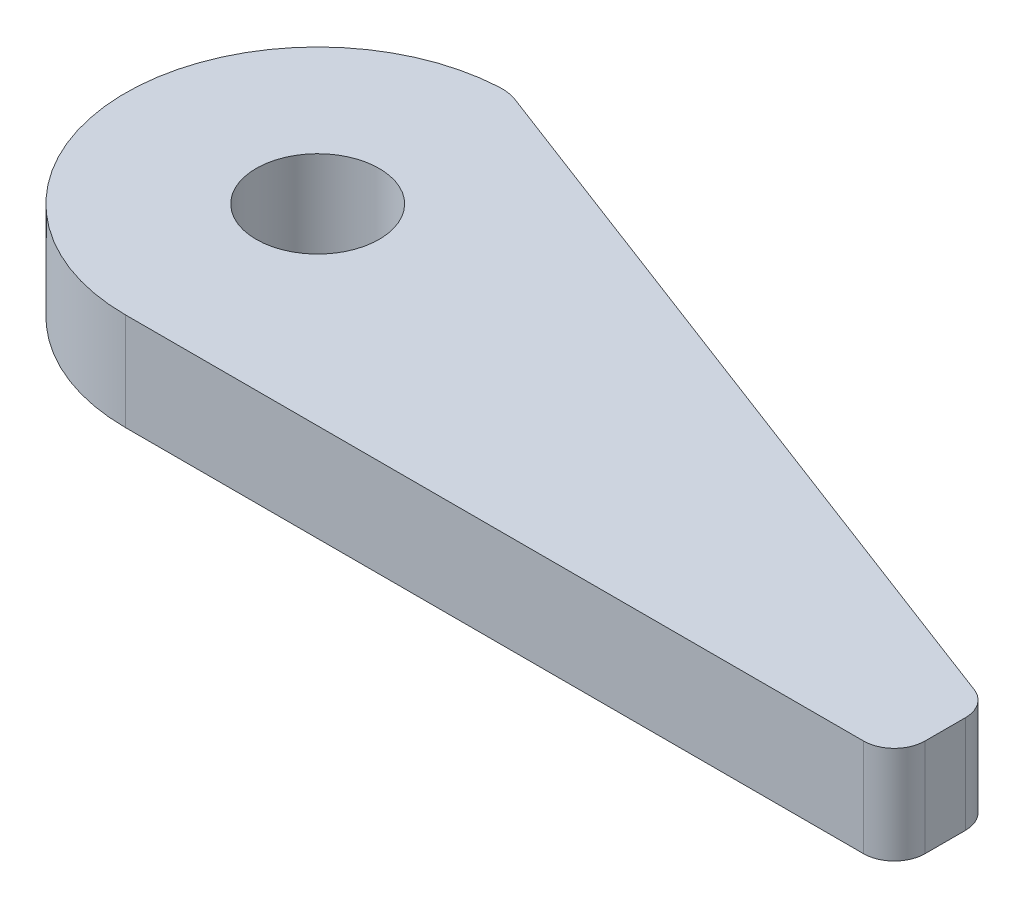
ISO-10303-21;
HEADER;
FILE_DESCRIPTION(('STEP AP214'),'2;1');
FILE_NAME('part.step','',(''),(''),'','','');
FILE_SCHEMA(('AUTOMOTIVE_DESIGN { 1 0 10303 214 1 1 1 1 }'));
ENDSEC;
DATA;
#1=APPLICATION_CONTEXT('core data for automotive mechanical design processes');
#2=APPLICATION_PROTOCOL_DEFINITION('international standard','automotive_design',2000,#1);
#3=PRODUCT_CONTEXT('',#1,'mechanical');
#4=PRODUCT('Part','Part','',(#3));
#5=PRODUCT_RELATED_PRODUCT_CATEGORY('part','',(#4));
#6=PRODUCT_DEFINITION_FORMATION('','',#4);
#7=PRODUCT_DEFINITION_CONTEXT('part definition',#1,'design');
#8=PRODUCT_DEFINITION('design','',#6,#7);
#9=PRODUCT_DEFINITION_SHAPE('','',#8);
#10=(LENGTH_UNIT() NAMED_UNIT(*) SI_UNIT(.MILLI.,.METRE.));
#11=(NAMED_UNIT(*) PLANE_ANGLE_UNIT() SI_UNIT($,.RADIAN.));
#12=(NAMED_UNIT(*) SI_UNIT($,.STERADIAN.) SOLID_ANGLE_UNIT());
#13=UNCERTAINTY_MEASURE_WITH_UNIT(LENGTH_MEASURE(1.E-05),#10,'distance_accuracy_value','');
#14=(GEOMETRIC_REPRESENTATION_CONTEXT(3) GLOBAL_UNCERTAINTY_ASSIGNED_CONTEXT((#13)) GLOBAL_UNIT_ASSIGNED_CONTEXT((#10,
#11,#12)) REPRESENTATION_CONTEXT('',''));
#15=CARTESIAN_POINT('',(0.,0.,0.));
#16=DIRECTION('',(0.,0.,1.));
#17=DIRECTION('',(1.,0.,0.));
#18=AXIS2_PLACEMENT_3D('',#15,#16,#17);
#19=CARTESIAN_POINT('',(0.,6.35,0.));
#20=DIRECTION('',(0.,1.,0.));
#21=DIRECTION('',(0.,0.,1.));
#22=AXIS2_PLACEMENT_3D('',#19,#20,#21);
#23=PLANE('',#22);
#24=DIRECTION('',(-0.934783580588349,0.,-0.355217760623573));
#25=VECTOR('',#24,1.);
#26=CARTESIAN_POINT('',(0.,6.35,-12.5));
#27=LINE('',#26,#25);
#28=CARTESIAN_POINT('',(48.7104355212471,6.35,6.00996549807391));
#29=VERTEX_POINT('',#28);
#30=CARTESIAN_POINT('',(0.551506469117387,6.35,-12.2904275417354));
#31=VERTEX_POINT('',#30);
#32=EDGE_CURVE('E116',#29,#31,#27,.T.);
#33=ORIENTED_EDGE('',*,*,#32,.T.);
#34=CARTESIAN_POINT('',(-0.514146812753331,6.35,-9.48607679997035));
#35=DIRECTION('',(0.,1.,0.));
#36=DIRECTION('',(0.,0.,1.));
#37=AXIS2_PLACEMENT_3D('',#34,#35,#36);
#38=CIRCLE('',#37,3.);
#39=CARTESIAN_POINT('',(-0.676508964149119,6.35,-12.481679999961));
#40=VERTEX_POINT('',#39);
#41=EDGE_CURVE('E11',#31,#40,#38,.T.);
#42=ORIENTED_EDGE('',*,*,#41,.T.);
#43=CARTESIAN_POINT('',(0.,6.35,0.));
#44=DIRECTION('',(0.,1.,0.));
#45=DIRECTION('',(0.,0.,1.));
#46=AXIS2_PLACEMENT_3D('',#43,#44,#45);
#47=CIRCLE('',#46,12.5);
#48=CARTESIAN_POINT('',(0.,6.35,12.5));
#49=VERTEX_POINT('',#48);
#50=EDGE_CURVE('E91',#40,#49,#47,.T.);
#51=ORIENTED_EDGE('',*,*,#50,.T.);
#52=DIRECTION('',(1.,0.,0.));
#53=VECTOR('',#52,1.);
#54=CARTESIAN_POINT('',(0.,6.35,12.5));
#55=LINE('',#54,#53);
#56=CARTESIAN_POINT('',(48.,6.35,12.5));
#57=VERTEX_POINT('',#56);
#58=EDGE_CURVE('E94',#49,#57,#55,.T.);
#59=ORIENTED_EDGE('',*,*,#58,.T.);
#60=CARTESIAN_POINT('',(48.,6.35,10.5));
#61=DIRECTION('',(0.,1.,0.));
#62=DIRECTION('',(0.,0.,1.));
#63=AXIS2_PLACEMENT_3D('',#60,#61,#62);
#64=CIRCLE('',#63,2.);
#65=CARTESIAN_POINT('',(50.,6.35,10.5));
#66=VERTEX_POINT('',#65);
#67=EDGE_CURVE('E133',#57,#66,#64,.T.);
#68=ORIENTED_EDGE('',*,*,#67,.T.);
#69=DIRECTION('',(0.,0.,-1.));
#70=VECTOR('',#69,1.);
#71=CARTESIAN_POINT('',(50.,6.35,6.5));
#72=LINE('',#71,#70);
#73=CARTESIAN_POINT('',(50.,6.35,7.87953265925061));
#74=VERTEX_POINT('',#73);
#75=EDGE_CURVE('E110',#66,#74,#72,.T.);
#76=ORIENTED_EDGE('',*,*,#75,.T.);
#77=CARTESIAN_POINT('',(48.,6.35,7.87953265925061));
#78=DIRECTION('',(0.,1.,0.));
#79=DIRECTION('',(0.,0.,1.));
#80=AXIS2_PLACEMENT_3D('',#77,#78,#79);
#81=CIRCLE('',#80,2.);
#82=EDGE_CURVE('E131',#74,#29,#81,.T.);
#83=ORIENTED_EDGE('',*,*,#82,.T.);
#84=EDGE_LOOP('',(#33,#42,#51,#59,#68,#76,#83));
#85=FACE_BOUND('',#84,.T.);
#86=CARTESIAN_POINT('',(0.,6.35,0.));
#87=DIRECTION('',(0.,1.,0.));
#88=DIRECTION('',(0.,0.,1.));
#89=AXIS2_PLACEMENT_3D('',#86,#87,#88);
#90=CIRCLE('',#89,4.);
#91=CARTESIAN_POINT('',(0.,6.35,4.));
#92=VERTEX_POINT('',#91);
#93=EDGE_CURVE('E144',#92,#92,#90,.T.);
#94=ORIENTED_EDGE('',*,*,#93,.F.);
#95=EDGE_LOOP('',(#94));
#96=FACE_BOUND('',#95,.T.);
#97=ADVANCED_FACE('F32',(#85,#96),#23,.T.);
#98=CARTESIAN_POINT('',(0.,0.,0.));
#99=DIRECTION('',(0.,1.,0.));
#100=DIRECTION('',(0.,0.,1.));
#101=AXIS2_PLACEMENT_3D('',#98,#99,#100);
#102=PLANE('',#101);
#103=CARTESIAN_POINT('',(0.,0.,0.));
#104=DIRECTION('',(0.,1.,0.));
#105=DIRECTION('',(0.,0.,1.));
#106=AXIS2_PLACEMENT_3D('',#103,#104,#105);
#107=CIRCLE('',#106,12.5);
#108=CARTESIAN_POINT('',(-0.676508964149119,0.,-12.481679999961));
#109=VERTEX_POINT('',#108);
#110=CARTESIAN_POINT('',(0.,0.,12.5));
#111=VERTEX_POINT('',#110);
#112=EDGE_CURVE('E113',#109,#111,#107,.T.);
#113=ORIENTED_EDGE('',*,*,#112,.F.);
#114=CARTESIAN_POINT('',(-0.514146812753331,0.,-9.48607679997035));
#115=DIRECTION('',(0.,1.,0.));
#116=DIRECTION('',(0.,0.,1.));
#117=AXIS2_PLACEMENT_3D('',#114,#115,#116);
#118=CIRCLE('',#117,3.);
#119=CARTESIAN_POINT('',(0.551506469117387,0.,-12.2904275417354));
#120=VERTEX_POINT('',#119);
#121=EDGE_CURVE('E54',#109,#120,#118,.F.);
#122=ORIENTED_EDGE('',*,*,#121,.T.);
#123=DIRECTION('',(-0.934783580588349,0.,-0.355217760623573));
#124=VECTOR('',#123,1.);
#125=CARTESIAN_POINT('',(0.,0.,-12.5));
#126=LINE('',#125,#124);
#127=CARTESIAN_POINT('',(48.7104355212471,0.,6.00996549807391));
#128=VERTEX_POINT('',#127);
#129=EDGE_CURVE('E101',#128,#120,#126,.T.);
#130=ORIENTED_EDGE('',*,*,#129,.F.);
#131=CARTESIAN_POINT('',(48.,0.,7.87953265925061));
#132=DIRECTION('',(0.,1.,0.));
#133=DIRECTION('',(0.,0.,1.));
#134=AXIS2_PLACEMENT_3D('',#131,#132,#133);
#135=CIRCLE('',#134,2.);
#136=CARTESIAN_POINT('',(50.,0.,7.87953265925061));
#137=VERTEX_POINT('',#136);
#138=EDGE_CURVE('E126',#128,#137,#135,.F.);
#139=ORIENTED_EDGE('',*,*,#138,.T.);
#140=DIRECTION('',(0.,0.,-1.));
#141=VECTOR('',#140,1.);
#142=CARTESIAN_POINT('',(50.,0.,6.5));
#143=LINE('',#142,#141);
#144=CARTESIAN_POINT('',(50.,0.,10.5));
#145=VERTEX_POINT('',#144);
#146=EDGE_CURVE('E146',#145,#137,#143,.T.);
#147=ORIENTED_EDGE('',*,*,#146,.F.);
#148=CARTESIAN_POINT('',(48.,0.,10.5));
#149=DIRECTION('',(0.,1.,0.));
#150=DIRECTION('',(0.,0.,1.));
#151=AXIS2_PLACEMENT_3D('',#148,#149,#150);
#152=CIRCLE('',#151,2.);
#153=CARTESIAN_POINT('',(48.,0.,12.5));
#154=VERTEX_POINT('',#153);
#155=EDGE_CURVE('E128',#145,#154,#152,.F.);
#156=ORIENTED_EDGE('',*,*,#155,.T.);
#157=DIRECTION('',(1.,0.,0.));
#158=VECTOR('',#157,1.);
#159=CARTESIAN_POINT('',(0.,0.,12.5));
#160=LINE('',#159,#158);
#161=EDGE_CURVE('E143',#111,#154,#160,.T.);
#162=ORIENTED_EDGE('',*,*,#161,.F.);
#163=EDGE_LOOP('',(#113,#122,#130,#139,#147,#156,#162));
#164=FACE_BOUND('',#163,.T.);
#165=CARTESIAN_POINT('',(0.,0.,0.));
#166=DIRECTION('',(0.,1.,0.));
#167=DIRECTION('',(0.,0.,1.));
#168=AXIS2_PLACEMENT_3D('',#165,#166,#167);
#169=CIRCLE('',#168,4.);
#170=CARTESIAN_POINT('',(0.,0.,4.));
#171=VERTEX_POINT('',#170);
#172=EDGE_CURVE('E149',#171,#171,#169,.T.);
#173=ORIENTED_EDGE('',*,*,#172,.T.);
#174=EDGE_LOOP('',(#173));
#175=FACE_BOUND('',#174,.T.);
#176=ADVANCED_FACE('F141',(#164,#175),#102,.F.);
#177=CARTESIAN_POINT('',(0.,6.35,0.));
#178=DIRECTION('',(0.,-1.,0.));
#179=DIRECTION('',(0.,0.,-1.));
#180=AXIS2_PLACEMENT_3D('',#177,#178,#179);
#181=CYLINDRICAL_SURFACE('',#180,12.5);
#182=ORIENTED_EDGE('',*,*,#50,.F.);
#183=DIRECTION('',(0.,-1.,0.));
#184=VECTOR('',#183,1.);
#185=CARTESIAN_POINT('',(-0.676508964149119,6.35,-12.481679999961));
#186=LINE('',#185,#184);
#187=EDGE_CURVE('E138',#40,#109,#186,.T.);
#188=ORIENTED_EDGE('',*,*,#187,.T.);
#189=ORIENTED_EDGE('',*,*,#112,.T.);
#190=DIRECTION('',(0.,-1.,0.));
#191=VECTOR('',#190,1.);
#192=CARTESIAN_POINT('',(0.,6.35,12.5));
#193=LINE('',#192,#191);
#194=EDGE_CURVE('E107',#49,#111,#193,.T.);
#195=ORIENTED_EDGE('',*,*,#194,.F.);
#196=EDGE_LOOP('',(#182,#188,#189,#195));
#197=FACE_BOUND('',#196,.T.);
#198=ADVANCED_FACE('F112',(#197),#181,.T.);
#199=CARTESIAN_POINT('',(0.,6.35,12.5));
#200=DIRECTION('',(0.,0.,-1.));
#201=DIRECTION('',(-1.,0.,0.));
#202=AXIS2_PLACEMENT_3D('',#199,#200,#201);
#203=PLANE('',#202);
#204=ORIENTED_EDGE('',*,*,#161,.T.);
#205=DIRECTION('',(0.,-1.,0.));
#206=VECTOR('',#205,1.);
#207=CARTESIAN_POINT('',(48.,6.35,12.5));
#208=LINE('',#207,#206);
#209=EDGE_CURVE('E109',#154,#57,#208,.F.);
#210=ORIENTED_EDGE('',*,*,#209,.T.);
#211=ORIENTED_EDGE('',*,*,#58,.F.);
#212=ORIENTED_EDGE('',*,*,#194,.T.);
#213=EDGE_LOOP('',(#204,#210,#211,#212));
#214=FACE_BOUND('',#213,.T.);
#215=ADVANCED_FACE('F106',(#214),#203,.F.);
#216=CARTESIAN_POINT('',(50.,6.35,6.5));
#217=DIRECTION('',(-1.,0.,0.));
#218=DIRECTION('',(0.,0.,1.));
#219=AXIS2_PLACEMENT_3D('',#216,#217,#218);
#220=PLANE('',#219);
#221=ORIENTED_EDGE('',*,*,#75,.F.);
#222=DIRECTION('',(0.,-1.,0.));
#223=VECTOR('',#222,1.);
#224=CARTESIAN_POINT('',(50.,6.35,10.5));
#225=LINE('',#224,#223);
#226=EDGE_CURVE('E118',#66,#145,#225,.T.);
#227=ORIENTED_EDGE('',*,*,#226,.T.);
#228=ORIENTED_EDGE('',*,*,#146,.T.);
#229=DIRECTION('',(0.,-1.,0.));
#230=VECTOR('',#229,1.);
#231=CARTESIAN_POINT('',(50.,6.35,7.87953265925061));
#232=LINE('',#231,#230);
#233=EDGE_CURVE('E115',#137,#74,#232,.F.);
#234=ORIENTED_EDGE('',*,*,#233,.T.);
#235=EDGE_LOOP('',(#221,#227,#228,#234));
#236=FACE_BOUND('',#235,.T.);
#237=ADVANCED_FACE('F176',(#236),#220,.F.);
#238=CARTESIAN_POINT('',(0.,6.35,-12.5));
#239=DIRECTION('',(-0.355217760623573,0.,0.934783580588349));
#240=DIRECTION('',(0.934783580588349,0.,0.355217760623573));
#241=AXIS2_PLACEMENT_3D('',#238,#239,#240);
#242=PLANE('',#241);
#243=ORIENTED_EDGE('',*,*,#129,.T.);
#244=DIRECTION('',(0.,-1.,0.));
#245=VECTOR('',#244,1.);
#246=CARTESIAN_POINT('',(0.551506469117387,6.35,-12.2904275417354));
#247=LINE('',#246,#245);
#248=EDGE_CURVE('E40',#120,#31,#247,.F.);
#249=ORIENTED_EDGE('',*,*,#248,.T.);
#250=ORIENTED_EDGE('',*,*,#32,.F.);
#251=DIRECTION('',(0.,-1.,0.));
#252=VECTOR('',#251,1.);
#253=CARTESIAN_POINT('',(48.7104355212472,6.35,6.00996549807392));
#254=LINE('',#253,#252);
#255=EDGE_CURVE('E135',#29,#128,#254,.T.);
#256=ORIENTED_EDGE('',*,*,#255,.T.);
#257=EDGE_LOOP('',(#243,#249,#250,#256));
#258=FACE_BOUND('',#257,.T.);
#259=ADVANCED_FACE('F156',(#258),#242,.F.);
#260=CARTESIAN_POINT('',(0.,6.35,0.));
#261=DIRECTION('',(0.,-1.,0.));
#262=DIRECTION('',(0.,0.,-1.));
#263=AXIS2_PLACEMENT_3D('',#260,#261,#262);
#264=CYLINDRICAL_SURFACE('',#263,4.);
#265=ORIENTED_EDGE('',*,*,#93,.T.);
#266=EDGE_LOOP('',(#265));
#267=FACE_BOUND('',#266,.T.);
#268=ORIENTED_EDGE('',*,*,#172,.F.);
#269=EDGE_LOOP('',(#268));
#270=FACE_BOUND('',#269,.T.);
#271=ADVANCED_FACE('F172',(#267,#270),#264,.F.);
#272=CARTESIAN_POINT('',(48.,6.35,10.5));
#273=DIRECTION('',(0.,-1.,0.));
#274=DIRECTION('',(0.,0.,-1.));
#275=AXIS2_PLACEMENT_3D('',#272,#273,#274);
#276=CYLINDRICAL_SURFACE('',#275,2.);
#277=ORIENTED_EDGE('',*,*,#67,.F.);
#278=ORIENTED_EDGE('',*,*,#209,.F.);
#279=ORIENTED_EDGE('',*,*,#155,.F.);
#280=ORIENTED_EDGE('',*,*,#226,.F.);
#281=EDGE_LOOP('',(#277,#278,#279,#280));
#282=FACE_BOUND('',#281,.T.);
#283=ADVANCED_FACE('F163',(#282),#276,.T.);
#284=CARTESIAN_POINT('',(48.,6.35,7.87953265925061));
#285=DIRECTION('',(0.,-1.,0.));
#286=DIRECTION('',(0.,0.,-1.));
#287=AXIS2_PLACEMENT_3D('',#284,#285,#286);
#288=CYLINDRICAL_SURFACE('',#287,2.);
#289=ORIENTED_EDGE('',*,*,#82,.F.);
#290=ORIENTED_EDGE('',*,*,#233,.F.);
#291=ORIENTED_EDGE('',*,*,#138,.F.);
#292=ORIENTED_EDGE('',*,*,#255,.F.);
#293=EDGE_LOOP('',(#289,#290,#291,#292));
#294=FACE_BOUND('',#293,.T.);
#295=ADVANCED_FACE('F159',(#294),#288,.T.);
#296=CARTESIAN_POINT('',(-0.514146812753331,6.35,-9.48607679997035));
#297=DIRECTION('',(0.,-1.,0.));
#298=DIRECTION('',(0.,0.,-1.));
#299=AXIS2_PLACEMENT_3D('',#296,#297,#298);
#300=CYLINDRICAL_SURFACE('',#299,3.);
#301=ORIENTED_EDGE('',*,*,#41,.F.);
#302=ORIENTED_EDGE('',*,*,#248,.F.);
#303=ORIENTED_EDGE('',*,*,#121,.F.);
#304=ORIENTED_EDGE('',*,*,#187,.F.);
#305=EDGE_LOOP('',(#301,#302,#303,#304));
#306=FACE_BOUND('',#305,.T.);
#307=ADVANCED_FACE('F34',(#306),#300,.T.);
#308=CLOSED_SHELL('',(#97,#176,#198,#215,#237,#259,#271,#283,#295,#307));
#309=MANIFOLD_SOLID_BREP('B2',#308);
#310=ADVANCED_BREP_SHAPE_REPRESENTATION('',(#18,#309),#14);
#311=SHAPE_DEFINITION_REPRESENTATION(#9,#310);
ENDSEC;
END-ISO-10303-21;
